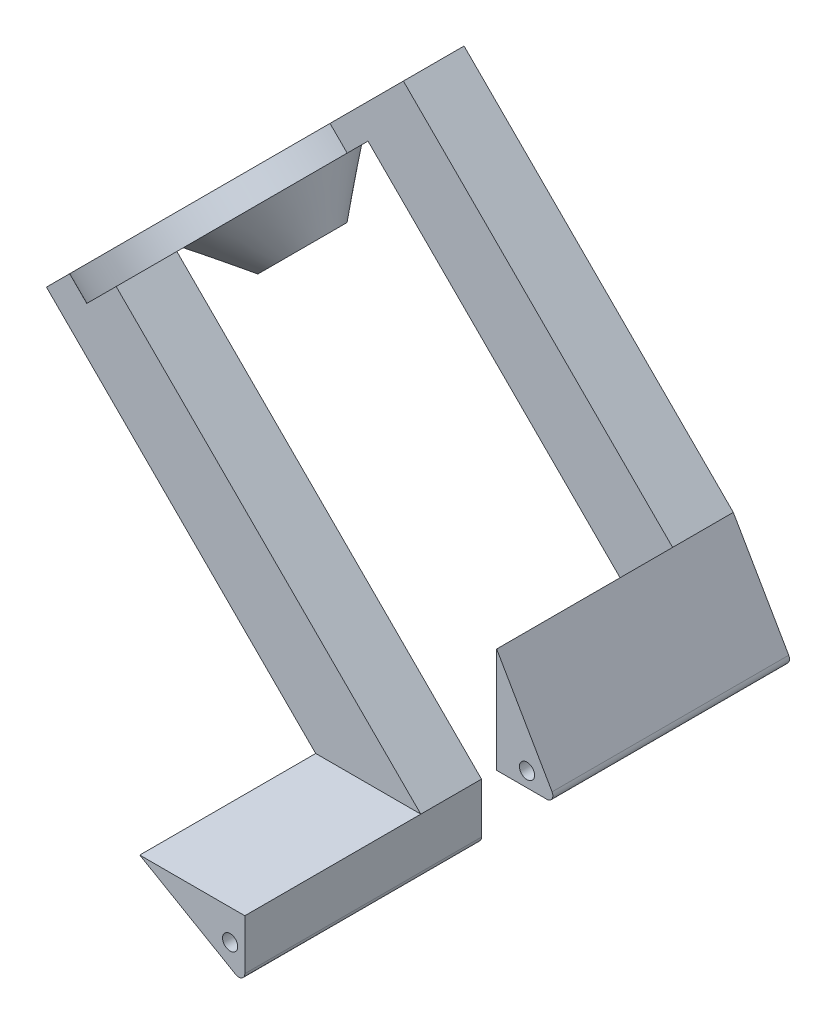
ISO-10303-21;
HEADER;
FILE_DESCRIPTION(('STEP AP214'),'2;1');
FILE_NAME('part.step','',(''),(''),'','','');
FILE_SCHEMA(('AUTOMOTIVE_DESIGN { 1 0 10303 214 1 1 1 1 }'));
ENDSEC;
DATA;
#1=APPLICATION_CONTEXT('core data for automotive mechanical design processes');
#2=APPLICATION_PROTOCOL_DEFINITION('international standard','automotive_design',2000,#1);
#3=PRODUCT_CONTEXT('',#1,'mechanical');
#4=PRODUCT('Part','Part','',(#3));
#5=PRODUCT_RELATED_PRODUCT_CATEGORY('part','',(#4));
#6=PRODUCT_DEFINITION_FORMATION('','',#4);
#7=PRODUCT_DEFINITION_CONTEXT('part definition',#1,'design');
#8=PRODUCT_DEFINITION('design','',#6,#7);
#9=PRODUCT_DEFINITION_SHAPE('','',#8);
#10=(LENGTH_UNIT() NAMED_UNIT(*) SI_UNIT(.MILLI.,.METRE.));
#11=(NAMED_UNIT(*) PLANE_ANGLE_UNIT() SI_UNIT($,.RADIAN.));
#12=(NAMED_UNIT(*) SI_UNIT($,.STERADIAN.) SOLID_ANGLE_UNIT());
#13=UNCERTAINTY_MEASURE_WITH_UNIT(LENGTH_MEASURE(1.E-05),#10,'distance_accuracy_value','');
#14=(GEOMETRIC_REPRESENTATION_CONTEXT(3) GLOBAL_UNCERTAINTY_ASSIGNED_CONTEXT((#13)) GLOBAL_UNIT_ASSIGNED_CONTEXT((#10,
#11,#12)) REPRESENTATION_CONTEXT('',''));
#15=CARTESIAN_POINT('',(0.,0.,0.));
#16=DIRECTION('',(0.,0.,1.));
#17=DIRECTION('',(1.,0.,0.));
#18=AXIS2_PLACEMENT_3D('',#15,#16,#17);
#19=CARTESIAN_POINT('',(0.,0.,-44.));
#20=DIRECTION('',(0.,0.,-1.));
#21=DIRECTION('',(-1.,0.,0.));
#22=AXIS2_PLACEMENT_3D('',#19,#20,#21);
#23=PLANE('',#22);
#24=DIRECTION('',(-0.500000000000001,0.866025403784438,0.));
#25=VECTOR('',#24,1.);
#26=CARTESIAN_POINT('',(-11.65,70.4705080756887,-44.));
#27=LINE('',#26,#25);
#28=CARTESIAN_POINT('',(-2.51602540378444,54.65,-44.));
#29=VERTEX_POINT('',#28);
#30=CARTESIAN_POINT('',(-11.65,70.4705080756887,-44.));
#31=VERTEX_POINT('',#30);
#32=EDGE_CURVE('E227',#29,#31,#27,.T.);
#33=ORIENTED_EDGE('',*,*,#32,.F.);
#34=CARTESIAN_POINT('',(-3.38205080756888,54.15,-44.));
#35=DIRECTION('',(0.,0.,-1.));
#36=DIRECTION('',(-1.,0.,0.));
#37=AXIS2_PLACEMENT_3D('',#34,#35,#36);
#38=CIRCLE('',#37,1.);
#39=CARTESIAN_POINT('',(-3.38205080756888,53.15,-44.));
#40=VERTEX_POINT('',#39);
#41=EDGE_CURVE('E11',#29,#40,#38,.T.);
#42=ORIENTED_EDGE('',*,*,#41,.T.);
#43=DIRECTION('',(1.,0.,0.));
#44=VECTOR('',#43,1.);
#45=CARTESIAN_POINT('',(-1.64999999999998,53.15,-44.));
#46=LINE('',#45,#44);
#47=CARTESIAN_POINT('',(-11.65,53.15,-44.));
#48=VERTEX_POINT('',#47);
#49=EDGE_CURVE('E229',#48,#40,#46,.T.);
#50=ORIENTED_EDGE('',*,*,#49,.F.);
#51=DIRECTION('',(0.707106781186548,-0.707106781186547,0.));
#52=VECTOR('',#51,1.);
#53=CARTESIAN_POINT('',(-11.65,53.15,-44.));
#54=LINE('',#53,#52);
#55=CARTESIAN_POINT('',(-61.8545814642449,103.354581464245,-44.));
#56=VERTEX_POINT('',#55);
#57=EDGE_CURVE('E233',#56,#48,#54,.T.);
#58=ORIENTED_EDGE('',*,*,#57,.F.);
#59=DIRECTION('',(0.707106781186548,0.707106781186548,0.));
#60=VECTOR('',#59,1.);
#61=CARTESIAN_POINT('',(-137.677063489673,27.5320994388169,-44.));
#62=LINE('',#61,#60);
#63=CARTESIAN_POINT('',(-65.2840733885561,99.9250895399336,-44.));
#64=VERTEX_POINT('',#63);
#65=EDGE_CURVE('E189',#64,#56,#62,.T.);
#66=ORIENTED_EDGE('',*,*,#65,.F.);
#67=DIRECTION('',(0.707106781186548,-0.707106781186547,0.));
#68=VECTOR('',#67,1.);
#69=CARTESIAN_POINT('',(-118.112500513302,152.75351666468,-44.));
#70=LINE('',#69,#68);
#71=CARTESIAN_POINT('',(-68.1125005133023,102.75351666468,-44.));
#72=VERTEX_POINT('',#71);
#73=EDGE_CURVE('E187',#72,#64,#70,.T.);
#74=ORIENTED_EDGE('',*,*,#73,.F.);
#75=DIRECTION('',(0.707106781186547,0.707106781186547,0.));
#76=VECTOR('',#75,1.);
#77=CARTESIAN_POINT('',(-106.183008588991,64.683008588991,-44.));
#78=LINE('',#77,#76);
#79=CARTESIAN_POINT('',(-56.0227545511467,114.843262626835,-44.));
#80=VERTEX_POINT('',#79);
#81=EDGE_CURVE('E172',#72,#80,#78,.T.);
#82=ORIENTED_EDGE('',*,*,#81,.T.);
#83=DIRECTION('',(-0.707106781186548,0.707106781186547,0.));
#84=VECTOR('',#83,1.);
#85=CARTESIAN_POINT('',(-56.0227545511467,114.843262626835,-44.));
#86=LINE('',#85,#84);
#87=EDGE_CURVE('E235',#31,#80,#86,.T.);
#88=ORIENTED_EDGE('',*,*,#87,.F.);
#89=EDGE_LOOP('',(#33,#42,#50,#58,#66,#74,#82,#88));
#90=FACE_BOUND('',#89,.T.);
#91=ADVANCED_FACE('F41',(#90),#23,.T.);
#92=CARTESIAN_POINT('',(0.,0.,-34.));
#93=DIRECTION('',(0.,0.,-1.));
#94=DIRECTION('',(-1.,0.,0.));
#95=AXIS2_PLACEMENT_3D('',#92,#93,#94);
#96=PLANE('',#95);
#97=DIRECTION('',(0.707106781186547,0.707106781186547,0.));
#98=VECTOR('',#97,1.);
#99=CARTESIAN_POINT('',(-106.183008588991,64.683008588991,-34.));
#100=LINE('',#99,#98);
#101=CARTESIAN_POINT('',(-68.1125005133023,102.75351666468,-34.));
#102=VERTEX_POINT('',#101);
#103=CARTESIAN_POINT('',(-56.0227545511467,114.843262626835,-34.));
#104=VERTEX_POINT('',#103);
#105=EDGE_CURVE('E274',#102,#104,#100,.T.);
#106=ORIENTED_EDGE('',*,*,#105,.F.);
#107=DIRECTION('',(0.707106781186548,-0.707106781186547,0.));
#108=VECTOR('',#107,1.);
#109=CARTESIAN_POINT('',(-118.112500513302,152.75351666468,-34.));
#110=LINE('',#109,#108);
#111=CARTESIAN_POINT('',(-65.2840733885561,99.9250895399337,-34.));
#112=VERTEX_POINT('',#111);
#113=EDGE_CURVE('E202',#102,#112,#110,.T.);
#114=ORIENTED_EDGE('',*,*,#113,.T.);
#115=DIRECTION('',(0.707106781186548,0.707106781186548,0.));
#116=VECTOR('',#115,1.);
#117=CARTESIAN_POINT('',(-137.677063489673,27.5320994388169,-34.));
#118=LINE('',#117,#116);
#119=CARTESIAN_POINT('',(-61.8545814642449,103.354581464245,-34.));
#120=VERTEX_POINT('',#119);
#121=EDGE_CURVE('E219',#112,#120,#118,.T.);
#122=ORIENTED_EDGE('',*,*,#121,.T.);
#123=DIRECTION('',(0.707106781186548,-0.707106781186547,0.));
#124=VECTOR('',#123,1.);
#125=CARTESIAN_POINT('',(-11.65,53.15,-34.));
#126=LINE('',#125,#124);
#127=CARTESIAN_POINT('',(-11.65,53.15,-34.));
#128=VERTEX_POINT('',#127);
#129=EDGE_CURVE('E226',#120,#128,#126,.T.);
#130=ORIENTED_EDGE('',*,*,#129,.T.);
#131=DIRECTION('',(0.,1.,0.));
#132=VECTOR('',#131,1.);
#133=CARTESIAN_POINT('',(-11.65,0.,-34.));
#134=LINE('',#133,#132);
#135=CARTESIAN_POINT('',(-11.65,70.4705080756887,-34.));
#136=VERTEX_POINT('',#135);
#137=EDGE_CURVE('E248',#128,#136,#134,.T.);
#138=ORIENTED_EDGE('',*,*,#137,.T.);
#139=DIRECTION('',(-0.707106781186548,0.707106781186547,0.));
#140=VECTOR('',#139,1.);
#141=CARTESIAN_POINT('',(-56.0227545511467,114.843262626835,-34.));
#142=LINE('',#141,#140);
#143=EDGE_CURVE('E230',#136,#104,#142,.T.);
#144=ORIENTED_EDGE('',*,*,#143,.T.);
#145=EDGE_LOOP('',(#106,#114,#122,#130,#138,#144));
#146=FACE_BOUND('',#145,.T.);
#147=ADVANCED_FACE('F355',(#146),#96,.F.);
#148=CARTESIAN_POINT('',(0.971953032018372,-53.15,-5.));
#149=DIRECTION('',(0.,0.,-1.));
#150=DIRECTION('',(-1.,0.,0.));
#151=AXIS2_PLACEMENT_3D('',#148,#149,#150);
#152=PLANE('',#151);
#153=CARTESIAN_POINT('',(-55.575,6.64999999999998,-5.00000000000001));
#154=DIRECTION('',(0.,0.,-1.));
#155=DIRECTION('',(-1.,0.,0.));
#156=AXIS2_PLACEMENT_3D('',#153,#154,#155);
#157=CIRCLE('',#156,1.24999999999999);
#158=CARTESIAN_POINT('',(-56.825,6.64999999999998,-5.00000000000001));
#159=VERTEX_POINT('',#158);
#160=EDGE_CURVE('E298',#159,#159,#157,.F.);
#161=ORIENTED_EDGE('',*,*,#160,.F.);
#162=EDGE_LOOP('',(#161));
#163=FACE_BOUND('',#162,.T.);
#164=DIRECTION('',(0.866025403784439,-0.5,0.));
#165=VECTOR('',#164,1.);
#166=CARTESIAN_POINT('',(-12.5730290418779,-21.7771251055715,-5.));
#167=LINE('',#166,#165);
#168=CARTESIAN_POINT('',(-70.4705080756887,11.65,-5.00000000000001));
#169=VERTEX_POINT('',#168);
#170=CARTESIAN_POINT('',(-54.65,2.51602540378443,-5.));
#171=VERTEX_POINT('',#170);
#172=EDGE_CURVE('E304',#169,#171,#167,.T.);
#173=ORIENTED_EDGE('',*,*,#172,.T.);
#174=CARTESIAN_POINT('',(-54.15,3.38205080756886,-5.));
#175=DIRECTION('',(0.,0.,-1.));
#176=DIRECTION('',(-1.,0.,0.));
#177=AXIS2_PLACEMENT_3D('',#174,#175,#176);
#178=CIRCLE('',#177,1.);
#179=CARTESIAN_POINT('',(-53.15,3.38205080756886,-5.));
#180=VERTEX_POINT('',#179);
#181=EDGE_CURVE('E315',#171,#180,#178,.F.);
#182=ORIENTED_EDGE('',*,*,#181,.T.);
#183=DIRECTION('',(0.,-1.,0.));
#184=VECTOR('',#183,1.);
#185=CARTESIAN_POINT('',(-53.15,-41.65,-5.));
#186=LINE('',#185,#184);
#187=CARTESIAN_POINT('',(-53.15,11.65,-5.));
#188=VERTEX_POINT('',#187);
#189=EDGE_CURVE('E301',#188,#180,#186,.T.);
#190=ORIENTED_EDGE('',*,*,#189,.F.);
#191=DIRECTION('',(-1.,0.,0.));
#192=VECTOR('',#191,1.);
#193=CARTESIAN_POINT('',(0.,11.65,-5.));
#194=LINE('',#193,#192);
#195=EDGE_CURVE('E305',#188,#169,#194,.T.);
#196=ORIENTED_EDGE('',*,*,#195,.T.);
#197=EDGE_LOOP('',(#173,#182,#190,#196));
#198=FACE_BOUND('',#197,.T.);
#199=ADVANCED_FACE('F361',(#163,#198),#152,.F.);
#200=CARTESIAN_POINT('',(-6.64999999999999,55.575,-5.00000000000001));
#201=DIRECTION('',(0.,0.,-1.));
#202=DIRECTION('',(-1.,0.,0.));
#203=AXIS2_PLACEMENT_3D('',#200,#201,#202);
#204=CIRCLE('',#203,1.24999999999999);
#205=CARTESIAN_POINT('',(-7.89999999999997,55.575,-5.00000000000001));
#206=VERTEX_POINT('',#205);
#207=EDGE_CURVE('E295',#206,#206,#204,.F.);
#208=ORIENTED_EDGE('',*,*,#207,.F.);
#209=EDGE_LOOP('',(#208));
#210=FACE_BOUND('',#209,.T.);
#211=DIRECTION('',(-1.,0.,0.));
#212=VECTOR('',#211,1.);
#213=CARTESIAN_POINT('',(-41.65,53.15,-5.));
#214=LINE('',#213,#212);
#215=CARTESIAN_POINT('',(-3.38205080756888,53.15,-5.));
#216=VERTEX_POINT('',#215);
#217=CARTESIAN_POINT('',(-11.65,53.15,-5.));
#218=VERTEX_POINT('',#217);
#219=EDGE_CURVE('E302',#216,#218,#214,.T.);
#220=ORIENTED_EDGE('',*,*,#219,.F.);
#221=CARTESIAN_POINT('',(-3.38205080756888,54.15,-5.));
#222=DIRECTION('',(0.,0.,-1.));
#223=DIRECTION('',(-1.,0.,0.));
#224=AXIS2_PLACEMENT_3D('',#221,#222,#223);
#225=CIRCLE('',#224,1.);
#226=CARTESIAN_POINT('',(-2.51602540378444,54.65,-5.));
#227=VERTEX_POINT('',#226);
#228=EDGE_CURVE('E64',#216,#227,#225,.F.);
#229=ORIENTED_EDGE('',*,*,#228,.T.);
#230=DIRECTION('',(0.5,-0.866025403784438,0.));
#231=VECTOR('',#230,1.);
#232=CARTESIAN_POINT('',(21.7771251055715,12.5730290418779,-5.));
#233=LINE('',#232,#231);
#234=CARTESIAN_POINT('',(-11.65,70.4705080756887,-5.));
#235=VERTEX_POINT('',#234);
#236=EDGE_CURVE('E252',#235,#227,#233,.T.);
#237=ORIENTED_EDGE('',*,*,#236,.F.);
#238=DIRECTION('',(0.,1.,0.));
#239=VECTOR('',#238,1.);
#240=CARTESIAN_POINT('',(-11.65,0.,-5.));
#241=LINE('',#240,#239);
#242=EDGE_CURVE('E247',#218,#235,#241,.T.);
#243=ORIENTED_EDGE('',*,*,#242,.F.);
#244=EDGE_LOOP('',(#220,#229,#237,#243));
#245=FACE_BOUND('',#244,.T.);
#246=ADVANCED_FACE('F334',(#210,#245),#152,.F.);
#247=CARTESIAN_POINT('',(-6.64999999999999,55.575,-24.81));
#248=DIRECTION('',(0.,0.,1.));
#249=DIRECTION('',(1.,0.,0.));
#250=AXIS2_PLACEMENT_3D('',#247,#248,#249);
#251=CONICAL_SURFACE('',#250,1.24999999999998,1.02974425867665);
#252=CARTESIAN_POINT('',(-6.65,55.575,-25.5610757737844));
#253=VERTEX_POINT('',#252);
#254=VERTEX_LOOP('',#253);
#255=FACE_BOUND('',#254,.T.);
#256=CARTESIAN_POINT('',(-6.64999999999999,55.575,-24.81));
#257=DIRECTION('',(0.,0.,1.));
#258=DIRECTION('',(1.,0.,0.));
#259=AXIS2_PLACEMENT_3D('',#256,#257,#258);
#260=CIRCLE('',#259,1.24999999999998);
#261=CARTESIAN_POINT('',(-5.4,55.575,-24.81));
#262=VERTEX_POINT('',#261);
#263=EDGE_CURVE('E223',#262,#262,#260,.T.);
#264=ORIENTED_EDGE('',*,*,#263,.T.);
#265=EDGE_LOOP('',(#264));
#266=FACE_BOUND('',#265,.T.);
#267=ADVANCED_FACE('F465',(#255,#266),#251,.F.);
#268=CARTESIAN_POINT('',(-6.64999999999999,55.575,5.));
#269=DIRECTION('',(0.,0.,1.));
#270=DIRECTION('',(1.,0.,0.));
#271=AXIS2_PLACEMENT_3D('',#268,#269,#270);
#272=CYLINDRICAL_SURFACE('',#271,1.24999999999999);
#273=ORIENTED_EDGE('',*,*,#207,.T.);
#274=EDGE_LOOP('',(#273));
#275=FACE_BOUND('',#274,.T.);
#276=ORIENTED_EDGE('',*,*,#263,.F.);
#277=EDGE_LOOP('',(#276));
#278=FACE_BOUND('',#277,.T.);
#279=ADVANCED_FACE('F462',(#275,#278),#272,.F.);
#280=CARTESIAN_POINT('',(-41.65,53.15,-155.33090168026));
#281=DIRECTION('',(0.,1.,0.));
#282=DIRECTION('',(0.,0.,1.));
#283=AXIS2_PLACEMENT_3D('',#280,#281,#282);
#284=PLANE('',#283);
#285=ORIENTED_EDGE('',*,*,#49,.T.);
#286=DIRECTION('',(0.,0.,1.));
#287=VECTOR('',#286,1.);
#288=CARTESIAN_POINT('',(-3.38205080756888,53.15,-155.33090168026));
#289=LINE('',#288,#287);
#290=EDGE_CURVE('E321',#40,#216,#289,.T.);
#291=ORIENTED_EDGE('',*,*,#290,.T.);
#292=ORIENTED_EDGE('',*,*,#219,.T.);
#293=DIRECTION('',(0.,0.,1.));
#294=VECTOR('',#293,1.);
#295=CARTESIAN_POINT('',(-11.65,53.15,-34.));
#296=LINE('',#295,#294);
#297=EDGE_CURVE('E251',#128,#218,#296,.T.);
#298=ORIENTED_EDGE('',*,*,#297,.F.);
#299=DIRECTION('',(0.,0.,1.));
#300=VECTOR('',#299,1.);
#301=CARTESIAN_POINT('',(-11.65,53.15,-44.));
#302=LINE('',#301,#300);
#303=EDGE_CURVE('E244',#48,#128,#302,.T.);
#304=ORIENTED_EDGE('',*,*,#303,.F.);
#305=EDGE_LOOP('',(#285,#291,#292,#298,#304));
#306=FACE_BOUND('',#305,.T.);
#307=ADVANCED_FACE('F327',(#306),#284,.F.);
#308=CARTESIAN_POINT('',(-53.15,-41.65,-155.33090168026));
#309=DIRECTION('',(-1.,0.,0.));
#310=DIRECTION('',(0.,0.,1.));
#311=AXIS2_PLACEMENT_3D('',#308,#309,#310);
#312=PLANE('',#311);
#313=ORIENTED_EDGE('',*,*,#189,.T.);
#314=DIRECTION('',(0.,0.,1.));
#315=VECTOR('',#314,1.);
#316=CARTESIAN_POINT('',(-53.15,3.38205080756886,-44.));
#317=LINE('',#316,#315);
#318=CARTESIAN_POINT('',(-53.15,3.38205080756886,-44.));
#319=VERTEX_POINT('',#318);
#320=EDGE_CURVE('E317',#180,#319,#317,.F.);
#321=ORIENTED_EDGE('',*,*,#320,.T.);
#322=DIRECTION('',(0.,-1.,0.));
#323=VECTOR('',#322,1.);
#324=CARTESIAN_POINT('',(-53.15,1.64999999999997,-44.));
#325=LINE('',#324,#323);
#326=CARTESIAN_POINT('',(-53.15,11.65,-44.));
#327=VERTEX_POINT('',#326);
#328=EDGE_CURVE('E269',#327,#319,#325,.T.);
#329=ORIENTED_EDGE('',*,*,#328,.F.);
#330=DIRECTION('',(0.,0.,1.));
#331=VECTOR('',#330,1.);
#332=CARTESIAN_POINT('',(-53.15,11.65,-44.));
#333=LINE('',#332,#331);
#334=CARTESIAN_POINT('',(-53.15,11.65,-34.));
#335=VERTEX_POINT('',#334);
#336=EDGE_CURVE('E272',#327,#335,#333,.T.);
#337=ORIENTED_EDGE('',*,*,#336,.T.);
#338=DIRECTION('',(0.,0.,1.));
#339=VECTOR('',#338,1.);
#340=CARTESIAN_POINT('',(-53.15,11.65,-34.));
#341=LINE('',#340,#339);
#342=EDGE_CURVE('E289',#335,#188,#341,.T.);
#343=ORIENTED_EDGE('',*,*,#342,.T.);
#344=EDGE_LOOP('',(#313,#321,#329,#337,#343));
#345=FACE_BOUND('',#344,.T.);
#346=ADVANCED_FACE('F601',(#345),#312,.F.);
#347=CARTESIAN_POINT('',(-12.5730290418779,-21.7771251055715,-34.));
#348=DIRECTION('',(-0.5,-0.866025403784438,0.));
#349=DIRECTION('',(0.866025403784439,-0.5,0.));
#350=AXIS2_PLACEMENT_3D('',#347,#348,#349);
#351=PLANE('',#350);
#352=DIRECTION('',(-0.866025403784438,0.5,0.));
#353=VECTOR('',#352,1.);
#354=CARTESIAN_POINT('',(-70.4705080756887,11.65,-44.));
#355=LINE('',#354,#353);
#356=CARTESIAN_POINT('',(-54.65,2.51602540378442,-44.));
#357=VERTEX_POINT('',#356);
#358=CARTESIAN_POINT('',(-70.4705080756887,11.65,-44.));
#359=VERTEX_POINT('',#358);
#360=EDGE_CURVE('E263',#357,#359,#355,.T.);
#361=ORIENTED_EDGE('',*,*,#360,.F.);
#362=DIRECTION('',(0.,0.,1.));
#363=VECTOR('',#362,1.);
#364=CARTESIAN_POINT('',(-54.65,2.51602540378442,-5.));
#365=LINE('',#364,#363);
#366=EDGE_CURVE('E308',#357,#171,#365,.T.);
#367=ORIENTED_EDGE('',*,*,#366,.T.);
#368=ORIENTED_EDGE('',*,*,#172,.F.);
#369=DIRECTION('',(0.,0.,1.));
#370=VECTOR('',#369,1.);
#371=CARTESIAN_POINT('',(-70.4705080756887,11.65,-34.));
#372=LINE('',#371,#370);
#373=CARTESIAN_POINT('',(-70.4705080756887,11.65,-34.));
#374=VERTEX_POINT('',#373);
#375=EDGE_CURVE('E292',#374,#169,#372,.T.);
#376=ORIENTED_EDGE('',*,*,#375,.F.);
#377=DIRECTION('',(0.,0.,1.));
#378=VECTOR('',#377,1.);
#379=CARTESIAN_POINT('',(-70.4705080756887,11.65,-44.));
#380=LINE('',#379,#378);
#381=EDGE_CURVE('E284',#359,#374,#380,.T.);
#382=ORIENTED_EDGE('',*,*,#381,.F.);
#383=EDGE_LOOP('',(#361,#367,#368,#376,#382));
#384=FACE_BOUND('',#383,.T.);
#385=ADVANCED_FACE('F385',(#384),#351,.T.);
#386=CARTESIAN_POINT('',(0.,11.65,-34.));
#387=DIRECTION('',(0.,1.,0.));
#388=DIRECTION('',(-1.,0.,0.));
#389=AXIS2_PLACEMENT_3D('',#386,#387,#388);
#390=PLANE('',#389);
#391=ORIENTED_EDGE('',*,*,#195,.F.);
#392=ORIENTED_EDGE('',*,*,#342,.F.);
#393=DIRECTION('',(-1.,0.,0.));
#394=VECTOR('',#393,1.);
#395=CARTESIAN_POINT('',(0.,11.65,-34.));
#396=LINE('',#395,#394);
#397=EDGE_CURVE('E286',#335,#374,#396,.T.);
#398=ORIENTED_EDGE('',*,*,#397,.T.);
#399=ORIENTED_EDGE('',*,*,#375,.T.);
#400=EDGE_LOOP('',(#391,#392,#398,#399));
#401=FACE_BOUND('',#400,.T.);
#402=ADVANCED_FACE('F392',(#401),#390,.T.);
#403=CARTESIAN_POINT('',(-114.843262626835,56.0227545511467,-44.));
#404=DIRECTION('',(0.707106781186548,0.707106781186547,0.));
#405=DIRECTION('',(-0.707106781186547,0.707106781186548,0.));
#406=AXIS2_PLACEMENT_3D('',#403,#404,#405);
#407=PLANE('',#406);
#408=DIRECTION('',(-0.707106781186547,0.707106781186548,0.));
#409=VECTOR('',#408,1.);
#410=CARTESIAN_POINT('',(-114.843262626835,56.0227545511467,-34.));
#411=LINE('',#410,#409);
#412=CARTESIAN_POINT('',(-114.843262626835,56.0227545511467,-34.));
#413=VERTEX_POINT('',#412);
#414=EDGE_CURVE('E262',#374,#413,#411,.T.);
#415=ORIENTED_EDGE('',*,*,#414,.T.);
#416=DIRECTION('',(0.,0.,1.));
#417=VECTOR('',#416,1.);
#418=CARTESIAN_POINT('',(-114.843262626835,56.0227545511467,-44.));
#419=LINE('',#418,#417);
#420=CARTESIAN_POINT('',(-114.843262626835,56.0227545511467,-44.));
#421=VERTEX_POINT('',#420);
#422=EDGE_CURVE('E281',#421,#413,#419,.T.);
#423=ORIENTED_EDGE('',*,*,#422,.F.);
#424=DIRECTION('',(-0.707106781186547,0.707106781186548,0.));
#425=VECTOR('',#424,1.);
#426=CARTESIAN_POINT('',(-114.843262626835,56.0227545511467,-44.));
#427=LINE('',#426,#425);
#428=EDGE_CURVE('E184',#359,#421,#427,.T.);
#429=ORIENTED_EDGE('',*,*,#428,.F.);
#430=ORIENTED_EDGE('',*,*,#381,.T.);
#431=EDGE_LOOP('',(#415,#423,#429,#430));
#432=FACE_BOUND('',#431,.T.);
#433=ADVANCED_FACE('F397',(#432),#407,.F.);
#434=CARTESIAN_POINT('',(-106.183008588991,64.683008588991,-44.));
#435=DIRECTION('',(0.707106781186548,-0.707106781186548,0.));
#436=DIRECTION('',(0.707106781186548,0.707106781186548,0.));
#437=AXIS2_PLACEMENT_3D('',#434,#435,#436);
#438=PLANE('',#437);
#439=CARTESIAN_POINT('',(-85.433008588991,85.433008588991,-60.));
#440=DIRECTION('',(0.707106781186548,-0.707106781186548,0.));
#441=DIRECTION('',(0.707106781186548,0.707106781186548,0.));
#442=AXIS2_PLACEMENT_3D('',#439,#440,#441);
#443=CIRCLE('',#442,0.799999999999992);
#444=CARTESIAN_POINT('',(-84.8673231640418,85.9986940139403,-60.));
#445=VERTEX_POINT('',#444);
#446=EDGE_CURVE('E45',#445,#445,#443,.T.);
#447=ORIENTED_EDGE('',*,*,#446,.T.);
#448=EDGE_LOOP('',(#447));
#449=FACE_BOUND('',#448,.T.);
#450=CARTESIAN_POINT('',(-74.1193000900063,96.7467170879758,-25.));
#451=DIRECTION('',(0.707106781186548,-0.707106781186548,0.));
#452=DIRECTION('',(0.707106781186548,0.707106781186548,0.));
#453=AXIS2_PLACEMENT_3D('',#450,#451,#452);
#454=CIRCLE('',#453,0.799999999999992);
#455=CARTESIAN_POINT('',(-73.553614665057,97.312402512925,-25.));
#456=VERTEX_POINT('',#455);
#457=EDGE_CURVE('E422',#456,#456,#454,.T.);
#458=ORIENTED_EDGE('',*,*,#457,.T.);
#459=EDGE_LOOP('',(#458));
#460=FACE_BOUND('',#459,.T.);
#461=CARTESIAN_POINT('',(-96.7467170879758,74.1193000900063,-25.));
#462=DIRECTION('',(0.707106781186548,-0.707106781186548,0.));
#463=DIRECTION('',(0.707106781186548,0.707106781186548,0.));
#464=AXIS2_PLACEMENT_3D('',#461,#462,#463);
#465=CIRCLE('',#464,0.799999999999992);
#466=CARTESIAN_POINT('',(-96.1810316630266,74.6849855149555,-25.));
#467=VERTEX_POINT('',#466);
#468=EDGE_CURVE('E414',#467,#467,#465,.T.);
#469=ORIENTED_EDGE('',*,*,#468,.T.);
#470=EDGE_LOOP('',(#469));
#471=FACE_BOUND('',#470,.T.);
#472=ORIENTED_EDGE('',*,*,#81,.F.);
#473=CARTESIAN_POINT('',(-85.433008588991,85.433008588991,-39.));
#474=DIRECTION('',(0.707106781186548,-0.707106781186548,0.));
#475=DIRECTION('',(0.707106781186548,0.707106781186548,0.));
#476=AXIS2_PLACEMENT_3D('',#473,#474,#475);
#477=CIRCLE('',#476,25.);
#478=CARTESIAN_POINT('',(-102.75351666468,68.1125005133023,-44.));
#479=VERTEX_POINT('',#478);
#480=EDGE_CURVE('E177',#72,#479,#477,.F.);
#481=ORIENTED_EDGE('',*,*,#480,.T.);
#482=EDGE_CURVE('E183',#421,#479,#78,.T.);
#483=ORIENTED_EDGE('',*,*,#482,.F.);
#484=ORIENTED_EDGE('',*,*,#422,.T.);
#485=CARTESIAN_POINT('',(-102.75351666468,68.1125005133023,-34.));
#486=VERTEX_POINT('',#485);
#487=EDGE_CURVE('E275',#413,#486,#100,.T.);
#488=ORIENTED_EDGE('',*,*,#487,.T.);
#489=EDGE_CURVE('E199',#486,#102,#477,.F.);
#490=ORIENTED_EDGE('',*,*,#489,.T.);
#491=ORIENTED_EDGE('',*,*,#105,.T.);
#492=DIRECTION('',(0.,0.,1.));
#493=VECTOR('',#492,1.);
#494=CARTESIAN_POINT('',(-56.0227545511467,114.843262626835,-44.));
#495=LINE('',#494,#493);
#496=EDGE_CURVE('E179',#80,#104,#495,.T.);
#497=ORIENTED_EDGE('',*,*,#496,.F.);
#498=EDGE_LOOP('',(#472,#481,#483,#484,#488,#490,#491,#497));
#499=FACE_BOUND('',#498,.T.);
#500=ADVANCED_FACE('F174',(#449,#460,#471,#499),#438,.F.);
#501=CARTESIAN_POINT('',(-53.15,11.65,-44.));
#502=DIRECTION('',(-0.707106781186547,-0.707106781186548,0.));
#503=DIRECTION('',(0.707106781186548,-0.707106781186547,0.));
#504=AXIS2_PLACEMENT_3D('',#501,#502,#503);
#505=PLANE('',#504);
#506=DIRECTION('',(0.707106781186548,-0.707106781186547,0.));
#507=VECTOR('',#506,1.);
#508=CARTESIAN_POINT('',(-53.15,11.65,-44.));
#509=LINE('',#508,#507);
#510=CARTESIAN_POINT('',(-103.354581464245,61.8545814642448,-44.));
#511=VERTEX_POINT('',#510);
#512=EDGE_CURVE('E267',#511,#327,#509,.T.);
#513=ORIENTED_EDGE('',*,*,#512,.F.);
#514=DIRECTION('',(0.,0.,-1.));
#515=VECTOR('',#514,1.);
#516=CARTESIAN_POINT('',(-103.354581464245,61.8545814642449,-44.));
#517=LINE('',#516,#515);
#518=CARTESIAN_POINT('',(-103.354581464245,61.8545814642448,-34.));
#519=VERTEX_POINT('',#518);
#520=EDGE_CURVE('E213',#519,#511,#517,.T.);
#521=ORIENTED_EDGE('',*,*,#520,.F.);
#522=DIRECTION('',(0.707106781186548,-0.707106781186547,0.));
#523=VECTOR('',#522,1.);
#524=CARTESIAN_POINT('',(-53.15,11.65,-34.));
#525=LINE('',#524,#523);
#526=EDGE_CURVE('E265',#519,#335,#525,.T.);
#527=ORIENTED_EDGE('',*,*,#526,.T.);
#528=ORIENTED_EDGE('',*,*,#336,.F.);
#529=EDGE_LOOP('',(#513,#521,#527,#528));
#530=FACE_BOUND('',#529,.T.);
#531=ADVANCED_FACE('F367',(#530),#505,.F.);
#532=ORIENTED_EDGE('',*,*,#328,.T.);
#533=CARTESIAN_POINT('',(-54.15,3.38205080756886,-44.));
#534=DIRECTION('',(0.,0.,-1.));
#535=DIRECTION('',(-1.,0.,0.));
#536=AXIS2_PLACEMENT_3D('',#533,#534,#535);
#537=CIRCLE('',#536,1.);
#538=EDGE_CURVE('E319',#319,#357,#537,.T.);
#539=ORIENTED_EDGE('',*,*,#538,.T.);
#540=ORIENTED_EDGE('',*,*,#360,.T.);
#541=ORIENTED_EDGE('',*,*,#428,.T.);
#542=ORIENTED_EDGE('',*,*,#482,.T.);
#543=DIRECTION('',(0.707106781186548,-0.707106781186547,0.));
#544=VECTOR('',#543,1.);
#545=CARTESIAN_POINT('',(-152.75351666468,118.112500513302,-44.));
#546=LINE('',#545,#544);
#547=CARTESIAN_POINT('',(-99.9250895399336,65.2840733885561,-44.));
#548=VERTEX_POINT('',#547);
#549=EDGE_CURVE('E194',#548,#479,#546,.F.);
#550=ORIENTED_EDGE('',*,*,#549,.F.);
#551=EDGE_CURVE('E216',#511,#548,#62,.T.);
#552=ORIENTED_EDGE('',*,*,#551,.F.);
#553=ORIENTED_EDGE('',*,*,#512,.T.);
#554=EDGE_LOOP('',(#532,#539,#540,#541,#542,#550,#552,#553));
#555=FACE_BOUND('',#554,.T.);
#556=ADVANCED_FACE('F357',(#555),#23,.T.);
#557=CARTESIAN_POINT('',(-99.9250895399337,65.2840733885561,-34.));
#558=VERTEX_POINT('',#557);
#559=EDGE_CURVE('E220',#519,#558,#118,.T.);
#560=ORIENTED_EDGE('',*,*,#559,.T.);
#561=DIRECTION('',(0.707106781186548,-0.707106781186547,0.));
#562=VECTOR('',#561,1.);
#563=CARTESIAN_POINT('',(-152.75351666468,118.112500513302,-34.));
#564=LINE('',#563,#562);
#565=EDGE_CURVE('E198',#558,#486,#564,.F.);
#566=ORIENTED_EDGE('',*,*,#565,.T.);
#567=ORIENTED_EDGE('',*,*,#487,.F.);
#568=ORIENTED_EDGE('',*,*,#414,.F.);
#569=ORIENTED_EDGE('',*,*,#397,.F.);
#570=ORIENTED_EDGE('',*,*,#526,.F.);
#571=EDGE_LOOP('',(#560,#566,#567,#568,#569,#570));
#572=FACE_BOUND('',#571,.T.);
#573=ADVANCED_FACE('F364',(#572),#96,.F.);
#574=CARTESIAN_POINT('',(-11.65,70.4705080756887,25.));
#575=DIRECTION('',(1.,0.,0.));
#576=DIRECTION('',(0.,0.,-1.));
#577=AXIS2_PLACEMENT_3D('',#574,#575,#576);
#578=PLANE('',#577);
#579=ORIENTED_EDGE('',*,*,#242,.T.);
#580=DIRECTION('',(0.,0.,-1.));
#581=VECTOR('',#580,1.);
#582=CARTESIAN_POINT('',(-11.65,70.4705080756887,25.));
#583=LINE('',#582,#581);
#584=EDGE_CURVE('E260',#235,#136,#583,.T.);
#585=ORIENTED_EDGE('',*,*,#584,.T.);
#586=ORIENTED_EDGE('',*,*,#137,.F.);
#587=ORIENTED_EDGE('',*,*,#297,.T.);
#588=EDGE_LOOP('',(#579,#585,#586,#587));
#589=FACE_BOUND('',#588,.T.);
#590=ADVANCED_FACE('F338',(#589),#578,.F.);
#591=CARTESIAN_POINT('',(-11.65,70.4705080756887,25.));
#592=DIRECTION('',(-0.866025403784438,-0.5,0.));
#593=DIRECTION('',(0.5,-0.866025403784439,0.));
#594=AXIS2_PLACEMENT_3D('',#591,#592,#593);
#595=PLANE('',#594);
#596=ORIENTED_EDGE('',*,*,#236,.T.);
#597=DIRECTION('',(0.,0.,1.));
#598=VECTOR('',#597,1.);
#599=CARTESIAN_POINT('',(-2.51602540378444,54.65,25.));
#600=LINE('',#599,#598);
#601=EDGE_CURVE('E50',#227,#29,#600,.F.);
#602=ORIENTED_EDGE('',*,*,#601,.T.);
#603=ORIENTED_EDGE('',*,*,#32,.T.);
#604=DIRECTION('',(0.,0.,1.));
#605=VECTOR('',#604,1.);
#606=CARTESIAN_POINT('',(-11.65,70.4705080756887,-44.));
#607=LINE('',#606,#605);
#608=EDGE_CURVE('E237',#31,#136,#607,.T.);
#609=ORIENTED_EDGE('',*,*,#608,.T.);
#610=ORIENTED_EDGE('',*,*,#584,.F.);
#611=EDGE_LOOP('',(#596,#602,#603,#609,#610));
#612=FACE_BOUND('',#611,.T.);
#613=ADVANCED_FACE('F475',(#612),#595,.F.);
#614=CARTESIAN_POINT('',(-11.65,53.15,-44.));
#615=DIRECTION('',(-0.707106781186547,-0.707106781186548,0.));
#616=DIRECTION('',(0.707106781186548,-0.707106781186547,0.));
#617=AXIS2_PLACEMENT_3D('',#614,#615,#616);
#618=PLANE('',#617);
#619=DIRECTION('',(0.,0.,1.));
#620=VECTOR('',#619,1.);
#621=CARTESIAN_POINT('',(-61.8545814642449,103.354581464245,-44.));
#622=LINE('',#621,#620);
#623=EDGE_CURVE('E193',#56,#120,#622,.T.);
#624=ORIENTED_EDGE('',*,*,#623,.F.);
#625=ORIENTED_EDGE('',*,*,#57,.T.);
#626=ORIENTED_EDGE('',*,*,#303,.T.);
#627=ORIENTED_EDGE('',*,*,#129,.F.);
#628=EDGE_LOOP('',(#624,#625,#626,#627));
#629=FACE_BOUND('',#628,.T.);
#630=ADVANCED_FACE('F342',(#629),#618,.T.);
#631=CARTESIAN_POINT('',(-56.0227545511467,114.843262626835,-44.));
#632=DIRECTION('',(0.707106781186547,0.707106781186548,0.));
#633=DIRECTION('',(-0.707106781186548,0.707106781186547,0.));
#634=AXIS2_PLACEMENT_3D('',#631,#632,#633);
#635=PLANE('',#634);
#636=ORIENTED_EDGE('',*,*,#143,.F.);
#637=ORIENTED_EDGE('',*,*,#608,.F.);
#638=ORIENTED_EDGE('',*,*,#87,.T.);
#639=ORIENTED_EDGE('',*,*,#496,.T.);
#640=EDGE_LOOP('',(#636,#637,#638,#639));
#641=FACE_BOUND('',#640,.T.);
#642=ADVANCED_FACE('F460',(#641),#635,.T.);
#643=CARTESIAN_POINT('',(-137.677063489673,27.5320994388169,-44.));
#644=DIRECTION('',(0.707106781186548,-0.707106781186548,0.));
#645=DIRECTION('',(0.707106781186548,0.707106781186548,0.));
#646=AXIS2_PLACEMENT_3D('',#643,#644,#645);
#647=PLANE('',#646);
#648=CARTESIAN_POINT('',(-82.6045814642449,82.6045814642449,-60.));
#649=DIRECTION('',(0.707106781186548,-0.707106781186547,0.));
#650=DIRECTION('',(0.707106781186547,0.707106781186548,0.));
#651=AXIS2_PLACEMENT_3D('',#648,#649,#650);
#652=CIRCLE('',#651,0.799999999999988);
#653=CARTESIAN_POINT('',(-82.0388960392957,83.1702668891941,-60.));
#654=VERTEX_POINT('',#653);
#655=EDGE_CURVE('E428',#654,#654,#652,.T.);
#656=ORIENTED_EDGE('',*,*,#655,.F.);
#657=EDGE_LOOP('',(#656));
#658=FACE_BOUND('',#657,.T.);
#659=CARTESIAN_POINT('',(-71.2908729652601,93.9182899632296,-25.));
#660=DIRECTION('',(0.707106781186548,-0.707106781186547,0.));
#661=DIRECTION('',(0.707106781186547,0.707106781186548,0.));
#662=AXIS2_PLACEMENT_3D('',#659,#660,#661);
#663=CIRCLE('',#662,0.799999999999988);
#664=CARTESIAN_POINT('',(-70.7251875403109,94.4839753881789,-25.));
#665=VERTEX_POINT('',#664);
#666=EDGE_CURVE('E425',#665,#665,#663,.T.);
#667=ORIENTED_EDGE('',*,*,#666,.F.);
#668=EDGE_LOOP('',(#667));
#669=FACE_BOUND('',#668,.T.);
#670=CARTESIAN_POINT('',(-93.9182899632296,71.2908729652601,-25.));
#671=DIRECTION('',(0.707106781186548,-0.707106781186547,0.));
#672=DIRECTION('',(0.707106781186547,0.707106781186548,0.));
#673=AXIS2_PLACEMENT_3D('',#670,#671,#672);
#674=CIRCLE('',#673,0.799999999999988);
#675=CARTESIAN_POINT('',(-93.3526045382804,71.8565583902093,-25.));
#676=VERTEX_POINT('',#675);
#677=EDGE_CURVE('E419',#676,#676,#674,.T.);
#678=ORIENTED_EDGE('',*,*,#677,.F.);
#679=EDGE_LOOP('',(#678));
#680=FACE_BOUND('',#679,.T.);
#681=CARTESIAN_POINT('',(-82.6045814642449,82.6045814642449,-39.));
#682=DIRECTION('',(-0.707106781186548,0.707106781186548,0.));
#683=DIRECTION('',(-0.707106781186548,-0.707106781186548,0.));
#684=AXIS2_PLACEMENT_3D('',#681,#682,#683);
#685=CIRCLE('',#684,12.);
#686=CARTESIAN_POINT('',(-91.0898628384834,74.1193000900063,-39.));
#687=VERTEX_POINT('',#686);
#688=EDGE_CURVE('E407',#687,#687,#685,.T.);
#689=ORIENTED_EDGE('',*,*,#688,.T.);
#690=EDGE_LOOP('',(#689));
#691=FACE_BOUND('',#690,.T.);
#692=ORIENTED_EDGE('',*,*,#121,.F.);
#693=CARTESIAN_POINT('',(-82.6045814642449,82.6045814642449,-39.));
#694=DIRECTION('',(0.707106781186548,-0.707106781186547,0.));
#695=DIRECTION('',(0.707106781186547,0.707106781186548,0.));
#696=AXIS2_PLACEMENT_3D('',#693,#694,#695);
#697=CIRCLE('',#696,25.);
#698=EDGE_CURVE('E204',#112,#558,#697,.T.);
#699=ORIENTED_EDGE('',*,*,#698,.T.);
#700=ORIENTED_EDGE('',*,*,#559,.F.);
#701=ORIENTED_EDGE('',*,*,#520,.T.);
#702=ORIENTED_EDGE('',*,*,#551,.T.);
#703=EDGE_CURVE('E404',#548,#64,#697,.T.);
#704=ORIENTED_EDGE('',*,*,#703,.T.);
#705=ORIENTED_EDGE('',*,*,#65,.T.);
#706=ORIENTED_EDGE('',*,*,#623,.T.);
#707=EDGE_LOOP('',(#692,#699,#700,#701,#702,#704,#705,#706));
#708=FACE_BOUND('',#707,.T.);
#709=ADVANCED_FACE('F403',(#658,#669,#680,#691,#708),#647,.T.);
#710=CARTESIAN_POINT('',(-55.575,6.64999999999998,-24.81));
#711=DIRECTION('',(0.,0.,1.));
#712=DIRECTION('',(1.,0.,0.));
#713=AXIS2_PLACEMENT_3D('',#710,#711,#712);
#714=CONICAL_SURFACE('',#713,1.24999999999999,1.02974425867665);
#715=CARTESIAN_POINT('',(-55.575,6.64999999999998,-25.5610757737844));
#716=VERTEX_POINT('',#715);
#717=VERTEX_LOOP('',#716);
#718=FACE_BOUND('',#717,.T.);
#719=CARTESIAN_POINT('',(-55.575,6.64999999999998,-24.81));
#720=DIRECTION('',(0.,0.,1.));
#721=DIRECTION('',(1.,0.,0.));
#722=AXIS2_PLACEMENT_3D('',#719,#720,#721);
#723=CIRCLE('',#722,1.24999999999999);
#724=CARTESIAN_POINT('',(-54.325,6.64999999999998,-24.81));
#725=VERTEX_POINT('',#724);
#726=EDGE_CURVE('E257',#725,#725,#723,.T.);
#727=ORIENTED_EDGE('',*,*,#726,.T.);
#728=EDGE_LOOP('',(#727));
#729=FACE_BOUND('',#728,.T.);
#730=ADVANCED_FACE('F459',(#718,#729),#714,.F.);
#731=CARTESIAN_POINT('',(-55.575,6.64999999999998,5.));
#732=DIRECTION('',(0.,0.,1.));
#733=DIRECTION('',(1.,0.,0.));
#734=AXIS2_PLACEMENT_3D('',#731,#732,#733);
#735=CYLINDRICAL_SURFACE('',#734,1.24999999999999);
#736=ORIENTED_EDGE('',*,*,#160,.T.);
#737=EDGE_LOOP('',(#736));
#738=FACE_BOUND('',#737,.T.);
#739=ORIENTED_EDGE('',*,*,#726,.F.);
#740=EDGE_LOOP('',(#739));
#741=FACE_BOUND('',#740,.T.);
#742=ADVANCED_FACE('F476',(#738,#741),#735,.F.);
#743=CARTESIAN_POINT('',(-135.433008588991,135.433008588991,-39.));
#744=DIRECTION('',(0.707106781186548,-0.707106781186547,0.));
#745=DIRECTION('',(0.707106781186547,0.707106781186548,0.));
#746=AXIS2_PLACEMENT_3D('',#743,#744,#745);
#747=CYLINDRICAL_SURFACE('',#746,25.);
#748=ORIENTED_EDGE('',*,*,#113,.F.);
#749=ORIENTED_EDGE('',*,*,#489,.F.);
#750=ORIENTED_EDGE('',*,*,#565,.F.);
#751=ORIENTED_EDGE('',*,*,#698,.F.);
#752=EDGE_LOOP('',(#748,#749,#750,#751));
#753=FACE_BOUND('',#752,.T.);
#754=ADVANCED_FACE('F456',(#753),#747,.T.);
#755=ORIENTED_EDGE('',*,*,#480,.F.);
#756=ORIENTED_EDGE('',*,*,#73,.T.);
#757=ORIENTED_EDGE('',*,*,#703,.F.);
#758=ORIENTED_EDGE('',*,*,#549,.T.);
#759=EDGE_LOOP('',(#755,#756,#757,#758));
#760=FACE_BOUND('',#759,.T.);
#761=ADVANCED_FACE('F197',(#760),#747,.T.);
#762=CARTESIAN_POINT('',(-54.15,3.38205080756886,-34.));
#763=DIRECTION('',(0.,0.,-1.));
#764=DIRECTION('',(-1.,0.,0.));
#765=AXIS2_PLACEMENT_3D('',#762,#763,#764);
#766=CYLINDRICAL_SURFACE('',#765,1.);
#767=ORIENTED_EDGE('',*,*,#538,.F.);
#768=ORIENTED_EDGE('',*,*,#320,.F.);
#769=ORIENTED_EDGE('',*,*,#181,.F.);
#770=ORIENTED_EDGE('',*,*,#366,.F.);
#771=EDGE_LOOP('',(#767,#768,#769,#770));
#772=FACE_BOUND('',#771,.T.);
#773=ADVANCED_FACE('F345',(#772),#766,.T.);
#774=CARTESIAN_POINT('',(-3.38205080756888,54.15,-155.33090168026));
#775=DIRECTION('',(0.,0.,1.));
#776=DIRECTION('',(1.,0.,0.));
#777=AXIS2_PLACEMENT_3D('',#774,#775,#776);
#778=CYLINDRICAL_SURFACE('',#777,1.);
#779=ORIENTED_EDGE('',*,*,#41,.F.);
#780=ORIENTED_EDGE('',*,*,#601,.F.);
#781=ORIENTED_EDGE('',*,*,#228,.F.);
#782=ORIENTED_EDGE('',*,*,#290,.F.);
#783=EDGE_LOOP('',(#779,#780,#781,#782));
#784=FACE_BOUND('',#783,.T.);
#785=ADVANCED_FACE('F43',(#784),#778,.T.);
#786=CARTESIAN_POINT('',(-77.654833995939,77.654833995939,-39.));
#787=DIRECTION('',(-0.707106781186548,0.707106781186548,0.));
#788=DIRECTION('',(-0.707106781186548,-0.707106781186548,0.));
#789=AXIS2_PLACEMENT_3D('',#786,#787,#788);
#790=CONICAL_SURFACE('',#789,5.99999999999999,0.708626272127671);
#791=ORIENTED_EDGE('',*,*,#688,.F.);
#792=EDGE_LOOP('',(#791));
#793=FACE_BOUND('',#792,.T.);
#794=CARTESIAN_POINT('',(-77.654833995939,77.654833995939,-39.));
#795=DIRECTION('',(-0.707106781186548,0.707106781186548,0.));
#796=DIRECTION('',(-0.707106781186548,-0.707106781186548,0.));
#797=AXIS2_PLACEMENT_3D('',#794,#795,#796);
#798=CIRCLE('',#797,5.99999999999999);
#799=CARTESIAN_POINT('',(-81.8974746830583,73.4121933088198,-39.));
#800=VERTEX_POINT('',#799);
#801=EDGE_CURVE('E410',#800,#800,#798,.T.);
#802=ORIENTED_EDGE('',*,*,#801,.T.);
#803=EDGE_LOOP('',(#802));
#804=FACE_BOUND('',#803,.T.);
#805=ADVANCED_FACE('F344',(#793,#804),#790,.T.);
#806=CARTESIAN_POINT('',(-77.654833995939,77.654833995939,-39.));
#807=DIRECTION('',(-0.707106781186548,0.707106781186548,0.));
#808=DIRECTION('',(0.,0.,-1.));
#809=AXIS2_PLACEMENT_3D('',#806,#807,#808);
#810=SPHERICAL_SURFACE('',#809,6.);
#811=ORIENTED_EDGE('',*,*,#801,.F.);
#812=EDGE_LOOP('',(#811));
#813=FACE_BOUND('',#812,.T.);
#814=ADVANCED_FACE('F350',(#813),#810,.F.);
#815=CARTESIAN_POINT('',(-93.9182899632296,71.2908729652601,-25.));
#816=DIRECTION('',(0.707106781186548,-0.707106781186547,0.));
#817=DIRECTION('',(0.707106781186547,0.707106781186548,0.));
#818=AXIS2_PLACEMENT_3D('',#815,#816,#817);
#819=CYLINDRICAL_SURFACE('',#818,0.799999999999992);
#820=ORIENTED_EDGE('',*,*,#677,.T.);
#821=EDGE_LOOP('',(#820));
#822=FACE_BOUND('',#821,.T.);
#823=ORIENTED_EDGE('',*,*,#468,.F.);
#824=EDGE_LOOP('',(#823));
#825=FACE_BOUND('',#824,.T.);
#826=ADVANCED_FACE('F444',(#822,#825),#819,.F.);
#827=CARTESIAN_POINT('',(-71.2908729652601,93.9182899632296,-25.));
#828=DIRECTION('',(0.707106781186548,-0.707106781186547,0.));
#829=DIRECTION('',(0.707106781186547,0.707106781186548,0.));
#830=AXIS2_PLACEMENT_3D('',#827,#828,#829);
#831=CYLINDRICAL_SURFACE('',#830,0.799999999999992);
#832=ORIENTED_EDGE('',*,*,#666,.T.);
#833=EDGE_LOOP('',(#832));
#834=FACE_BOUND('',#833,.T.);
#835=ORIENTED_EDGE('',*,*,#457,.F.);
#836=EDGE_LOOP('',(#835));
#837=FACE_BOUND('',#836,.T.);
#838=ADVANCED_FACE('F439',(#834,#837),#831,.F.);
#839=CARTESIAN_POINT('',(-82.6045814642449,82.6045814642449,-60.));
#840=DIRECTION('',(0.707106781186548,-0.707106781186547,0.));
#841=DIRECTION('',(0.707106781186547,0.707106781186548,0.));
#842=AXIS2_PLACEMENT_3D('',#839,#840,#841);
#843=CYLINDRICAL_SURFACE('',#842,0.799999999999992);
#844=ORIENTED_EDGE('',*,*,#655,.T.);
#845=EDGE_LOOP('',(#844));
#846=FACE_BOUND('',#845,.T.);
#847=ORIENTED_EDGE('',*,*,#446,.F.);
#848=EDGE_LOOP('',(#847));
#849=FACE_BOUND('',#848,.T.);
#850=ADVANCED_FACE('F437',(#846,#849),#843,.F.);
#851=CLOSED_SHELL('',(#91,#147,#199,#246,#267,#279,#307,#346,#385,#402,#433,#500,#531,#556,#573,
#590,#613,#630,#642,#709,#730,#742,#754,#761,#773,#785,#805,#814,#826,#838,#850));
#852=MANIFOLD_SOLID_BREP('B2',#851);
#853=ADVANCED_BREP_SHAPE_REPRESENTATION('',(#18,#852),#14);
#854=SHAPE_DEFINITION_REPRESENTATION(#9,#853);
ENDSEC;
END-ISO-10303-21;
